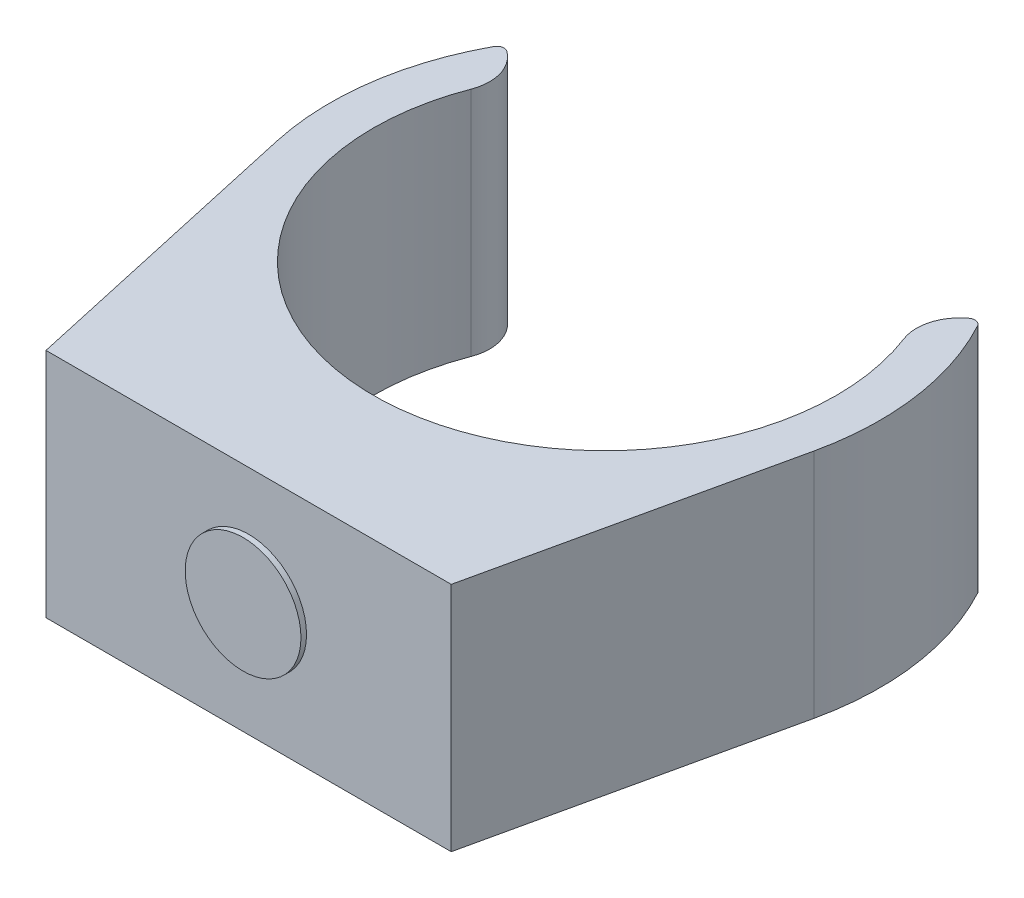
ISO-10303-21;
HEADER;
FILE_DESCRIPTION(('STEP AP214'),'2;1');
FILE_NAME('part.step','',(''),(''),'','','');
FILE_SCHEMA(('AUTOMOTIVE_DESIGN { 1 0 10303 214 1 1 1 1 }'));
ENDSEC;
DATA;
#1=APPLICATION_CONTEXT('core data for automotive mechanical design processes');
#2=APPLICATION_PROTOCOL_DEFINITION('international standard','automotive_design',2000,#1);
#3=PRODUCT_CONTEXT('',#1,'mechanical');
#4=PRODUCT('Part','Part','',(#3));
#5=PRODUCT_RELATED_PRODUCT_CATEGORY('part','',(#4));
#6=PRODUCT_DEFINITION_FORMATION('','',#4);
#7=PRODUCT_DEFINITION_CONTEXT('part definition',#1,'design');
#8=PRODUCT_DEFINITION('design','',#6,#7);
#9=PRODUCT_DEFINITION_SHAPE('','',#8);
#10=(LENGTH_UNIT() NAMED_UNIT(*) SI_UNIT(.MILLI.,.METRE.));
#11=(NAMED_UNIT(*) PLANE_ANGLE_UNIT() SI_UNIT($,.RADIAN.));
#12=(NAMED_UNIT(*) SI_UNIT($,.STERADIAN.) SOLID_ANGLE_UNIT());
#13=UNCERTAINTY_MEASURE_WITH_UNIT(LENGTH_MEASURE(1.E-05),#10,'distance_accuracy_value','');
#14=(GEOMETRIC_REPRESENTATION_CONTEXT(3) GLOBAL_UNCERTAINTY_ASSIGNED_CONTEXT((#13)) GLOBAL_UNIT_ASSIGNED_CONTEXT((#10,
#11,#12)) REPRESENTATION_CONTEXT('',''));
#15=CARTESIAN_POINT('',(0.,0.,0.));
#16=DIRECTION('',(0.,0.,1.));
#17=DIRECTION('',(1.,0.,0.));
#18=AXIS2_PLACEMENT_3D('',#15,#16,#17);
#19=CARTESIAN_POINT('',(0.,16.,0.));
#20=DIRECTION('',(0.,-1.,0.));
#21=DIRECTION('',(0.,0.,-1.));
#22=AXIS2_PLACEMENT_3D('',#19,#20,#21);
#23=CYLINDRICAL_SURFACE('',#22,19.);
#24=DIRECTION('',(0.,1.,0.));
#25=VECTOR('',#24,1.);
#26=CARTESIAN_POINT('',(-18.5488400018444,-42.3849957137676,4.11588806771715));
#27=LINE('',#26,#25);
#28=CARTESIAN_POINT('',(-18.5488400018444,0.,4.11588806771716));
#29=VERTEX_POINT('',#28);
#30=CARTESIAN_POINT('',(-18.5488400018444,16.,4.11588806771716));
#31=VERTEX_POINT('',#30);
#32=EDGE_CURVE('E60',#29,#31,#27,.T.);
#33=ORIENTED_EDGE('',*,*,#32,.T.);
#34=CARTESIAN_POINT('',(0.,16.,0.));
#35=DIRECTION('',(0.,1.,0.));
#36=DIRECTION('',(0.,0.,1.));
#37=AXIS2_PLACEMENT_3D('',#34,#35,#36);
#38=CIRCLE('',#37,19.);
#39=CARTESIAN_POINT('',(-16.7123182697726,16.,-9.03871772154788));
#40=VERTEX_POINT('',#39);
#41=EDGE_CURVE('E139',#40,#31,#38,.T.);
#42=ORIENTED_EDGE('',*,*,#41,.F.);
#43=DIRECTION('',(0.,-1.,0.));
#44=VECTOR('',#43,1.);
#45=CARTESIAN_POINT('',(-16.7123182697726,16.,-9.03871772154788));
#46=LINE('',#45,#44);
#47=CARTESIAN_POINT('',(-16.7123182697726,0.,-9.03871772154788));
#48=VERTEX_POINT('',#47);
#49=EDGE_CURVE('E186',#40,#48,#46,.T.);
#50=ORIENTED_EDGE('',*,*,#49,.T.);
#51=CARTESIAN_POINT('',(0.,0.,0.));
#52=DIRECTION('',(0.,1.,0.));
#53=DIRECTION('',(0.,0.,1.));
#54=AXIS2_PLACEMENT_3D('',#51,#52,#53);
#55=CIRCLE('',#54,19.);
#56=EDGE_CURVE('E158',#48,#29,#55,.T.);
#57=ORIENTED_EDGE('',*,*,#56,.T.);
#58=EDGE_LOOP('',(#33,#42,#50,#57));
#59=FACE_BOUND('',#58,.T.);
#60=ADVANCED_FACE('F37',(#59),#23,.T.);
#61=CARTESIAN_POINT('',(0.,16.,0.));
#62=DIRECTION('',(0.,-1.,0.));
#63=DIRECTION('',(0.,0.,-1.));
#64=AXIS2_PLACEMENT_3D('',#61,#62,#63);
#65=CYLINDRICAL_SURFACE('',#64,16.);
#66=DIRECTION('',(0.,-1.,0.));
#67=VECTOR('',#66,1.);
#68=CARTESIAN_POINT('',(14.9457488920185,16.,-5.71179394382611));
#69=LINE('',#68,#67);
#70=CARTESIAN_POINT('',(14.9457488920185,16.,-5.71179394382611));
#71=VERTEX_POINT('',#70);
#72=CARTESIAN_POINT('',(14.9457488920185,0.,-5.71179394382611));
#73=VERTEX_POINT('',#72);
#74=EDGE_CURVE('E168',#71,#73,#69,.T.);
#75=ORIENTED_EDGE('',*,*,#74,.T.);
#76=CARTESIAN_POINT('',(0.,0.,0.));
#77=DIRECTION('',(0.,1.,0.));
#78=DIRECTION('',(0.,0.,1.));
#79=AXIS2_PLACEMENT_3D('',#76,#77,#78);
#80=CIRCLE('',#79,16.);
#81=CARTESIAN_POINT('',(-14.9457488920185,0.,-5.71179394382611));
#82=VERTEX_POINT('',#81);
#83=EDGE_CURVE('E155',#82,#73,#80,.T.);
#84=ORIENTED_EDGE('',*,*,#83,.F.);
#85=DIRECTION('',(0.,-1.,0.));
#86=VECTOR('',#85,1.);
#87=CARTESIAN_POINT('',(-14.9457488920185,16.,-5.71179394382611));
#88=LINE('',#87,#86);
#89=CARTESIAN_POINT('',(-14.9457488920185,16.,-5.71179394382611));
#90=VERTEX_POINT('',#89);
#91=EDGE_CURVE('E171',#82,#90,#88,.F.);
#92=ORIENTED_EDGE('',*,*,#91,.T.);
#93=CARTESIAN_POINT('',(0.,16.,0.));
#94=DIRECTION('',(0.,1.,0.));
#95=DIRECTION('',(0.,0.,1.));
#96=AXIS2_PLACEMENT_3D('',#93,#94,#95);
#97=CIRCLE('',#96,16.);
#98=EDGE_CURVE('E156',#90,#71,#97,.T.);
#99=ORIENTED_EDGE('',*,*,#98,.T.);
#100=EDGE_LOOP('',(#75,#84,#92,#99));
#101=FACE_BOUND('',#100,.T.);
#102=ADVANCED_FACE('F223',(#101),#65,.F.);
#103=CARTESIAN_POINT('',(18.5488400018444,16.,4.11588806771715));
#104=VERTEX_POINT('',#103);
#105=CARTESIAN_POINT('',(16.7123182697726,16.,-9.03871772154787));
#106=VERTEX_POINT('',#105);
#107=EDGE_CURVE('E52',#104,#106,#38,.T.);
#108=ORIENTED_EDGE('',*,*,#107,.F.);
#109=DIRECTION('',(0.,1.,0.));
#110=VECTOR('',#109,1.);
#111=CARTESIAN_POINT('',(18.5488400018444,-42.3849957137676,4.11588806771715));
#112=LINE('',#111,#110);
#113=CARTESIAN_POINT('',(18.5488400018444,0.,4.11588806771715));
#114=VERTEX_POINT('',#113);
#115=EDGE_CURVE('E146',#114,#104,#112,.T.);
#116=ORIENTED_EDGE('',*,*,#115,.F.);
#117=CARTESIAN_POINT('',(16.7123182697726,0.,-9.03871772154787));
#118=VERTEX_POINT('',#117);
#119=EDGE_CURVE('E162',#114,#118,#55,.T.);
#120=ORIENTED_EDGE('',*,*,#119,.T.);
#121=DIRECTION('',(0.,-1.,0.));
#122=VECTOR('',#121,1.);
#123=CARTESIAN_POINT('',(16.7123182697726,16.,-9.03871772154787));
#124=LINE('',#123,#122);
#125=EDGE_CURVE('E189',#118,#106,#124,.F.);
#126=ORIENTED_EDGE('',*,*,#125,.T.);
#127=EDGE_LOOP('',(#108,#116,#120,#126));
#128=FACE_BOUND('',#127,.T.);
#129=ADVANCED_FACE('F213',(#128),#23,.T.);
#130=CARTESIAN_POINT('',(-37.0877506732344,16.,4.75000000000002));
#131=DIRECTION('',(0.,1.,0.));
#132=DIRECTION('',(0.,0.,1.));
#133=AXIS2_PLACEMENT_3D('',#130,#131,#132);
#134=PLANE('',#133);
#135=CARTESIAN_POINT('',(17.7480768092719,16.,-6.7827553082935));
#136=DIRECTION('',(0.,1.,0.));
#137=DIRECTION('',(0.,0.,1.));
#138=AXIS2_PLACEMENT_3D('',#135,#136,#137);
#139=CIRCLE('',#138,3.);
#140=CARTESIAN_POINT('',(15.9774091428273,16.,-9.20447701299196));
#141=VERTEX_POINT('',#140);
#142=EDGE_CURVE('E173',#141,#71,#139,.T.);
#143=ORIENTED_EDGE('',*,*,#142,.T.);
#144=ORIENTED_EDGE('',*,*,#98,.F.);
#145=CARTESIAN_POINT('',(-17.7480768092719,16.,-6.78275530829351));
#146=DIRECTION('',(0.,1.,0.));
#147=DIRECTION('',(0.,0.,1.));
#148=AXIS2_PLACEMENT_3D('',#145,#146,#147);
#149=CIRCLE('',#148,3.);
#150=CARTESIAN_POINT('',(-15.9774091428273,16.,-9.20447701299197));
#151=VERTEX_POINT('',#150);
#152=EDGE_CURVE('E175',#90,#151,#149,.T.);
#153=ORIENTED_EDGE('',*,*,#152,.T.);
#154=CARTESIAN_POINT('',(-16.2725204205681,16.,-8.80085672887557));
#155=DIRECTION('',(0.,1.,0.));
#156=DIRECTION('',(0.,0.,1.));
#157=AXIS2_PLACEMENT_3D('',#154,#155,#156);
#158=CIRCLE('',#157,0.5);
#159=EDGE_CURVE('E191',#151,#40,#158,.T.);
#160=ORIENTED_EDGE('',*,*,#159,.T.);
#161=ORIENTED_EDGE('',*,*,#41,.T.);
#162=DIRECTION('',(0.216625687774587,0.,0.97625473693918));
#163=VECTOR('',#162,1.);
#164=CARTESIAN_POINT('',(-18.5488400018444,16.,4.11588806771715));
#165=LINE('',#164,#163);
#166=CARTESIAN_POINT('',(-14.,16.,24.6158880677172));
#167=VERTEX_POINT('',#166);
#168=EDGE_CURVE('E121',#31,#167,#165,.T.);
#169=ORIENTED_EDGE('',*,*,#168,.T.);
#170=DIRECTION('',(1.,0.,0.));
#171=VECTOR('',#170,1.);
#172=CARTESIAN_POINT('',(-14.,16.,24.6158880677172));
#173=LINE('',#172,#171);
#174=CARTESIAN_POINT('',(14.,16.,24.6158880677172));
#175=VERTEX_POINT('',#174);
#176=EDGE_CURVE('E129',#167,#175,#173,.T.);
#177=ORIENTED_EDGE('',*,*,#176,.T.);
#178=DIRECTION('',(0.216625687774587,0.,-0.97625473693918));
#179=VECTOR('',#178,1.);
#180=CARTESIAN_POINT('',(18.5488400018444,16.,4.11588806771715));
#181=LINE('',#180,#179);
#182=EDGE_CURVE('E135',#175,#104,#181,.T.);
#183=ORIENTED_EDGE('',*,*,#182,.T.);
#184=ORIENTED_EDGE('',*,*,#107,.T.);
#185=CARTESIAN_POINT('',(16.2725204205681,16.,-8.80085672887555));
#186=DIRECTION('',(0.,1.,0.));
#187=DIRECTION('',(0.,0.,1.));
#188=AXIS2_PLACEMENT_3D('',#185,#186,#187);
#189=CIRCLE('',#188,0.5);
#190=EDGE_CURVE('E193',#106,#141,#189,.T.);
#191=ORIENTED_EDGE('',*,*,#190,.T.);
#192=EDGE_LOOP('',(#143,#144,#153,#160,#161,#169,#177,#183,#184,#191));
#193=FACE_BOUND('',#192,.T.);
#194=ADVANCED_FACE('F138',(#193),#134,.T.);
#195=CARTESIAN_POINT('',(-37.0877506732344,0.,4.75000000000002));
#196=DIRECTION('',(0.,1.,0.));
#197=DIRECTION('',(0.,0.,1.));
#198=AXIS2_PLACEMENT_3D('',#195,#196,#197);
#199=PLANE('',#198);
#200=ORIENTED_EDGE('',*,*,#119,.F.);
#201=DIRECTION('',(-0.216625687774587,0.,0.97625473693918));
#202=VECTOR('',#201,1.);
#203=CARTESIAN_POINT('',(18.5488400018444,0.,4.11588806771715));
#204=LINE('',#203,#202);
#205=CARTESIAN_POINT('',(14.,0.,24.6158880677172));
#206=VERTEX_POINT('',#205);
#207=EDGE_CURVE('E142',#114,#206,#204,.T.);
#208=ORIENTED_EDGE('',*,*,#207,.T.);
#209=DIRECTION('',(-1.,0.,0.));
#210=VECTOR('',#209,1.);
#211=CARTESIAN_POINT('',(-14.,0.,24.6158880677172));
#212=LINE('',#211,#210);
#213=CARTESIAN_POINT('',(-14.,0.,24.6158880677172));
#214=VERTEX_POINT('',#213);
#215=EDGE_CURVE('E148',#206,#214,#212,.T.);
#216=ORIENTED_EDGE('',*,*,#215,.T.);
#217=DIRECTION('',(-0.216625687774587,0.,-0.97625473693918));
#218=VECTOR('',#217,1.);
#219=CARTESIAN_POINT('',(-18.5488400018444,0.,4.11588806771715));
#220=LINE('',#219,#218);
#221=EDGE_CURVE('E123',#214,#29,#220,.T.);
#222=ORIENTED_EDGE('',*,*,#221,.T.);
#223=ORIENTED_EDGE('',*,*,#56,.F.);
#224=CARTESIAN_POINT('',(-16.2725204205681,0.,-8.80085672887557));
#225=DIRECTION('',(0.,1.,0.));
#226=DIRECTION('',(0.,0.,1.));
#227=AXIS2_PLACEMENT_3D('',#224,#225,#226);
#228=CIRCLE('',#227,0.5);
#229=CARTESIAN_POINT('',(-15.9774091428273,0.,-9.20447701299197));
#230=VERTEX_POINT('',#229);
#231=EDGE_CURVE('E181',#48,#230,#228,.F.);
#232=ORIENTED_EDGE('',*,*,#231,.T.);
#233=CARTESIAN_POINT('',(-17.7480768092719,0.,-6.78275530829351));
#234=DIRECTION('',(0.,1.,0.));
#235=DIRECTION('',(0.,0.,1.));
#236=AXIS2_PLACEMENT_3D('',#233,#234,#235);
#237=CIRCLE('',#236,3.);
#238=EDGE_CURVE('E166',#230,#82,#237,.F.);
#239=ORIENTED_EDGE('',*,*,#238,.T.);
#240=ORIENTED_EDGE('',*,*,#83,.T.);
#241=CARTESIAN_POINT('',(17.7480768092719,0.,-6.7827553082935));
#242=DIRECTION('',(0.,1.,0.));
#243=DIRECTION('',(0.,0.,1.));
#244=AXIS2_PLACEMENT_3D('',#241,#242,#243);
#245=CIRCLE('',#244,3.);
#246=CARTESIAN_POINT('',(15.9774091428273,0.,-9.20447701299196));
#247=VERTEX_POINT('',#246);
#248=EDGE_CURVE('E160',#73,#247,#245,.F.);
#249=ORIENTED_EDGE('',*,*,#248,.T.);
#250=CARTESIAN_POINT('',(16.2725204205681,0.,-8.80085672887555));
#251=DIRECTION('',(0.,1.,0.));
#252=DIRECTION('',(0.,0.,1.));
#253=AXIS2_PLACEMENT_3D('',#250,#251,#252);
#254=CIRCLE('',#253,0.5);
#255=EDGE_CURVE('E183',#247,#118,#254,.F.);
#256=ORIENTED_EDGE('',*,*,#255,.T.);
#257=EDGE_LOOP('',(#200,#208,#216,#222,#223,#232,#239,#240,#249,#256));
#258=FACE_BOUND('',#257,.T.);
#259=ADVANCED_FACE('F206',(#258),#199,.F.);
#260=CARTESIAN_POINT('',(-17.7480768092719,16.,-6.78275530829351));
#261=DIRECTION('',(0.,-1.,0.));
#262=DIRECTION('',(0.,0.,-1.));
#263=AXIS2_PLACEMENT_3D('',#260,#261,#262);
#264=CYLINDRICAL_SURFACE('',#263,3.);
#265=ORIENTED_EDGE('',*,*,#238,.F.);
#266=DIRECTION('',(0.,-1.,0.));
#267=VECTOR('',#266,1.);
#268=CARTESIAN_POINT('',(-15.9774091428273,16.,-9.20447701299197));
#269=LINE('',#268,#267);
#270=EDGE_CURVE('E45',#230,#151,#269,.F.);
#271=ORIENTED_EDGE('',*,*,#270,.T.);
#272=ORIENTED_EDGE('',*,*,#152,.F.);
#273=ORIENTED_EDGE('',*,*,#91,.F.);
#274=EDGE_LOOP('',(#265,#271,#272,#273));
#275=FACE_BOUND('',#274,.T.);
#276=ADVANCED_FACE('F198',(#275),#264,.T.);
#277=CARTESIAN_POINT('',(17.7480768092719,16.,-6.7827553082935));
#278=DIRECTION('',(0.,-1.,0.));
#279=DIRECTION('',(0.,0.,-1.));
#280=AXIS2_PLACEMENT_3D('',#277,#278,#279);
#281=CYLINDRICAL_SURFACE('',#280,3.);
#282=ORIENTED_EDGE('',*,*,#142,.F.);
#283=DIRECTION('',(0.,-1.,0.));
#284=VECTOR('',#283,1.);
#285=CARTESIAN_POINT('',(15.9774091428273,16.,-9.20447701299196));
#286=LINE('',#285,#284);
#287=EDGE_CURVE('E178',#141,#247,#286,.T.);
#288=ORIENTED_EDGE('',*,*,#287,.T.);
#289=ORIENTED_EDGE('',*,*,#248,.F.);
#290=ORIENTED_EDGE('',*,*,#74,.F.);
#291=EDGE_LOOP('',(#282,#288,#289,#290));
#292=FACE_BOUND('',#291,.T.);
#293=ADVANCED_FACE('F219',(#292),#281,.T.);
#294=CARTESIAN_POINT('',(16.2725204205681,16.,-8.80085672887555));
#295=DIRECTION('',(0.,-1.,0.));
#296=DIRECTION('',(0.,0.,-1.));
#297=AXIS2_PLACEMENT_3D('',#294,#295,#296);
#298=CYLINDRICAL_SURFACE('',#297,0.5);
#299=ORIENTED_EDGE('',*,*,#190,.F.);
#300=ORIENTED_EDGE('',*,*,#125,.F.);
#301=ORIENTED_EDGE('',*,*,#255,.F.);
#302=ORIENTED_EDGE('',*,*,#287,.F.);
#303=EDGE_LOOP('',(#299,#300,#301,#302));
#304=FACE_BOUND('',#303,.T.);
#305=ADVANCED_FACE('F216',(#304),#298,.T.);
#306=CARTESIAN_POINT('',(-16.2725204205681,16.,-8.80085672887557));
#307=DIRECTION('',(0.,-1.,0.));
#308=DIRECTION('',(0.,0.,-1.));
#309=AXIS2_PLACEMENT_3D('',#306,#307,#308);
#310=CYLINDRICAL_SURFACE('',#309,0.5);
#311=ORIENTED_EDGE('',*,*,#159,.F.);
#312=ORIENTED_EDGE('',*,*,#270,.F.);
#313=ORIENTED_EDGE('',*,*,#231,.F.);
#314=ORIENTED_EDGE('',*,*,#49,.F.);
#315=EDGE_LOOP('',(#311,#312,#313,#314));
#316=FACE_BOUND('',#315,.T.);
#317=ADVANCED_FACE('F39',(#316),#310,.T.);
#318=CARTESIAN_POINT('',(18.5488400018444,-42.3849957137676,4.11588806771715));
#319=DIRECTION('',(0.97625473693918,0.,0.216625687774587));
#320=DIRECTION('',(0.216625687774587,0.,-0.97625473693918));
#321=AXIS2_PLACEMENT_3D('',#318,#319,#320);
#322=PLANE('',#321);
#323=ORIENTED_EDGE('',*,*,#207,.F.);
#324=ORIENTED_EDGE('',*,*,#115,.T.);
#325=ORIENTED_EDGE('',*,*,#182,.F.);
#326=DIRECTION('',(0.,1.,0.));
#327=VECTOR('',#326,1.);
#328=CARTESIAN_POINT('',(14.,-42.3849957137676,24.6158880677172));
#329=LINE('',#328,#327);
#330=EDGE_CURVE('E126',#206,#175,#329,.T.);
#331=ORIENTED_EDGE('',*,*,#330,.F.);
#332=EDGE_LOOP('',(#323,#324,#325,#331));
#333=FACE_BOUND('',#332,.T.);
#334=ADVANCED_FACE('F209',(#333),#322,.T.);
#335=CARTESIAN_POINT('',(-14.,-42.3849957137676,24.6158880677172));
#336=DIRECTION('',(0.,0.,1.));
#337=DIRECTION('',(1.,0.,0.));
#338=AXIS2_PLACEMENT_3D('',#335,#336,#337);
#339=PLANE('',#338);
#340=CARTESIAN_POINT('',(0.,8.,24.6158880677172));
#341=DIRECTION('',(0.,0.,1.));
#342=DIRECTION('',(1.,0.,0.));
#343=AXIS2_PLACEMENT_3D('',#340,#341,#342);
#344=CIRCLE('',#343,4.);
#345=CARTESIAN_POINT('',(4.,8.,24.6158880677172));
#346=VERTEX_POINT('',#345);
#347=EDGE_CURVE('E11',#346,#346,#344,.F.);
#348=ORIENTED_EDGE('',*,*,#347,.T.);
#349=EDGE_LOOP('',(#348));
#350=FACE_BOUND('',#349,.T.);
#351=ORIENTED_EDGE('',*,*,#215,.F.);
#352=ORIENTED_EDGE('',*,*,#330,.T.);
#353=ORIENTED_EDGE('',*,*,#176,.F.);
#354=DIRECTION('',(0.,1.,0.));
#355=VECTOR('',#354,1.);
#356=CARTESIAN_POINT('',(-14.,-42.3849957137676,24.6158880677172));
#357=LINE('',#356,#355);
#358=EDGE_CURVE('E117',#214,#167,#357,.T.);
#359=ORIENTED_EDGE('',*,*,#358,.F.);
#360=EDGE_LOOP('',(#351,#352,#353,#359));
#361=FACE_BOUND('',#360,.T.);
#362=ADVANCED_FACE('F130',(#350,#361),#339,.T.);
#363=CARTESIAN_POINT('',(-18.5488400018444,-42.3849957137676,4.11588806771715));
#364=DIRECTION('',(-0.97625473693918,0.,0.216625687774587));
#365=DIRECTION('',(0.216625687774587,0.,0.97625473693918));
#366=AXIS2_PLACEMENT_3D('',#363,#364,#365);
#367=PLANE('',#366);
#368=ORIENTED_EDGE('',*,*,#221,.F.);
#369=ORIENTED_EDGE('',*,*,#358,.T.);
#370=ORIENTED_EDGE('',*,*,#168,.F.);
#371=ORIENTED_EDGE('',*,*,#32,.F.);
#372=EDGE_LOOP('',(#368,#369,#370,#371));
#373=FACE_BOUND('',#372,.T.);
#374=ADVANCED_FACE('F119',(#373),#367,.T.);
#375=CARTESIAN_POINT('',(0.,8.,25.));
#376=DIRECTION('',(0.,0.,1.));
#377=DIRECTION('',(1.,0.,0.));
#378=AXIS2_PLACEMENT_3D('',#375,#376,#377);
#379=PLANE('',#378);
#380=CARTESIAN_POINT('',(0.,8.,25.));
#381=DIRECTION('',(0.,0.,1.));
#382=DIRECTION('',(1.,0.,0.));
#383=AXIS2_PLACEMENT_3D('',#380,#381,#382);
#384=CIRCLE('',#383,4.);
#385=CARTESIAN_POINT('',(4.,8.,25.));
#386=VERTEX_POINT('',#385);
#387=EDGE_CURVE('E152',#386,#386,#384,.T.);
#388=ORIENTED_EDGE('',*,*,#387,.T.);
#389=EDGE_LOOP('',(#388));
#390=FACE_BOUND('',#389,.T.);
#391=ADVANCED_FACE('F252',(#390),#379,.T.);
#392=CARTESIAN_POINT('',(0.,8.,-9.50099999999997));
#393=DIRECTION('',(0.,0.,1.));
#394=DIRECTION('',(1.,0.,0.));
#395=AXIS2_PLACEMENT_3D('',#392,#393,#394);
#396=CYLINDRICAL_SURFACE('',#395,4.);
#397=ORIENTED_EDGE('',*,*,#347,.F.);
#398=EDGE_LOOP('',(#397));
#399=FACE_BOUND('',#398,.T.);
#400=ORIENTED_EDGE('',*,*,#387,.F.);
#401=EDGE_LOOP('',(#400));
#402=FACE_BOUND('',#401,.T.);
#403=ADVANCED_FACE('F255',(#399,#402),#396,.T.);
#404=CLOSED_SHELL('',(#60,#102,#129,#194,#259,#276,#293,#305,#317,#334,#362,#374,#391,#403));
#405=MANIFOLD_SOLID_BREP('B2',#404);
#406=ADVANCED_BREP_SHAPE_REPRESENTATION('',(#18,#405),#14);
#407=SHAPE_DEFINITION_REPRESENTATION(#9,#406);
ENDSEC;
END-ISO-10303-21;
